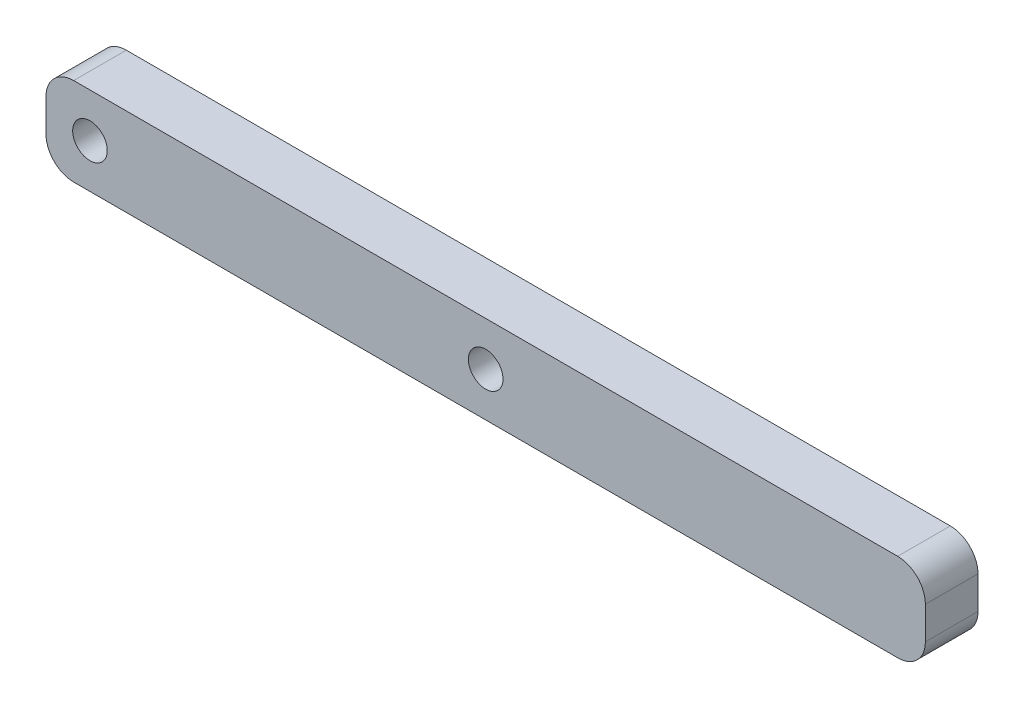
ISO-10303-21;
HEADER;
FILE_DESCRIPTION(('STEP AP214'),'2;1');
FILE_NAME('part.step','',(''),(''),'','','');
FILE_SCHEMA(('AUTOMOTIVE_DESIGN { 1 0 10303 214 1 1 1 1 }'));
ENDSEC;
DATA;
#1=APPLICATION_CONTEXT('core data for automotive mechanical design processes');
#2=APPLICATION_PROTOCOL_DEFINITION('international standard','automotive_design',2000,#1);
#3=PRODUCT_CONTEXT('',#1,'mechanical');
#4=PRODUCT('Part','Part','',(#3));
#5=PRODUCT_RELATED_PRODUCT_CATEGORY('part','',(#4));
#6=PRODUCT_DEFINITION_FORMATION('','',#4);
#7=PRODUCT_DEFINITION_CONTEXT('part definition',#1,'design');
#8=PRODUCT_DEFINITION('design','',#6,#7);
#9=PRODUCT_DEFINITION_SHAPE('','',#8);
#10=(LENGTH_UNIT() NAMED_UNIT(*) SI_UNIT(.MILLI.,.METRE.));
#11=(NAMED_UNIT(*) PLANE_ANGLE_UNIT() SI_UNIT($,.RADIAN.));
#12=(NAMED_UNIT(*) SI_UNIT($,.STERADIAN.) SOLID_ANGLE_UNIT());
#13=UNCERTAINTY_MEASURE_WITH_UNIT(LENGTH_MEASURE(1.E-05),#10,'distance_accuracy_value','');
#14=(GEOMETRIC_REPRESENTATION_CONTEXT(3) GLOBAL_UNCERTAINTY_ASSIGNED_CONTEXT((#13)) GLOBAL_UNIT_ASSIGNED_CONTEXT((#10,
#11,#12)) REPRESENTATION_CONTEXT('',''));
#15=CARTESIAN_POINT('',(0.,0.,0.));
#16=DIRECTION('',(0.,0.,1.));
#17=DIRECTION('',(1.,0.,0.));
#18=AXIS2_PLACEMENT_3D('',#15,#16,#17);
#19=CARTESIAN_POINT('',(0.,0.,7.6));
#20=DIRECTION('',(0.,0.,1.));
#21=DIRECTION('',(1.,0.,0.));
#22=AXIS2_PLACEMENT_3D('',#19,#20,#21);
#23=PLANE('',#22);
#24=CARTESIAN_POINT('',(-120.65,6.35,7.6));
#25=DIRECTION('',(0.,0.,1.));
#26=DIRECTION('',(1.,0.,0.));
#27=AXIS2_PLACEMENT_3D('',#24,#25,#26);
#28=CIRCLE('',#27,2.5);
#29=CARTESIAN_POINT('',(-123.15,6.35,7.6));
#30=VERTEX_POINT('',#29);
#31=EDGE_CURVE('E132',#30,#30,#28,.T.);
#32=ORIENTED_EDGE('',*,*,#31,.F.);
#33=EDGE_LOOP('',(#32));
#34=FACE_BOUND('',#33,.T.);
#35=DIRECTION('',(0.,-1.,0.));
#36=VECTOR('',#35,1.);
#37=CARTESIAN_POINT('',(-127.,12.7,7.6));
#38=LINE('',#37,#36);
#39=CARTESIAN_POINT('',(-127.,8.7,7.6));
#40=VERTEX_POINT('',#39);
#41=CARTESIAN_POINT('',(-127.,4.,7.6));
#42=VERTEX_POINT('',#41);
#43=EDGE_CURVE('E137',#40,#42,#38,.T.);
#44=ORIENTED_EDGE('',*,*,#43,.T.);
#45=CARTESIAN_POINT('',(-123.,4.,7.6));
#46=DIRECTION('',(0.,0.,1.));
#47=DIRECTION('',(1.,0.,0.));
#48=AXIS2_PLACEMENT_3D('',#45,#46,#47);
#49=CIRCLE('',#48,4.);
#50=CARTESIAN_POINT('',(-123.,0.,7.6));
#51=VERTEX_POINT('',#50);
#52=EDGE_CURVE('E152',#42,#51,#49,.T.);
#53=ORIENTED_EDGE('',*,*,#52,.T.);
#54=DIRECTION('',(1.,0.,0.));
#55=VECTOR('',#54,1.);
#56=CARTESIAN_POINT('',(-127.,0.,7.6));
#57=LINE('',#56,#55);
#58=CARTESIAN_POINT('',(-4.,0.,7.6));
#59=VERTEX_POINT('',#58);
#60=EDGE_CURVE('E119',#51,#59,#57,.T.);
#61=ORIENTED_EDGE('',*,*,#60,.T.);
#62=CARTESIAN_POINT('',(-4.,4.,7.6));
#63=DIRECTION('',(0.,0.,1.));
#64=DIRECTION('',(1.,0.,0.));
#65=AXIS2_PLACEMENT_3D('',#62,#63,#64);
#66=CIRCLE('',#65,4.);
#67=CARTESIAN_POINT('',(0.,4.,7.6));
#68=VERTEX_POINT('',#67);
#69=EDGE_CURVE('E150',#59,#68,#66,.T.);
#70=ORIENTED_EDGE('',*,*,#69,.T.);
#71=DIRECTION('',(0.,1.,0.));
#72=VECTOR('',#71,1.);
#73=CARTESIAN_POINT('',(0.,12.7,7.6));
#74=LINE('',#73,#72);
#75=CARTESIAN_POINT('',(0.,8.7,7.6));
#76=VERTEX_POINT('',#75);
#77=EDGE_CURVE('E163',#68,#76,#74,.T.);
#78=ORIENTED_EDGE('',*,*,#77,.T.);
#79=CARTESIAN_POINT('',(-4.,8.7,7.6));
#80=DIRECTION('',(0.,0.,1.));
#81=DIRECTION('',(1.,0.,0.));
#82=AXIS2_PLACEMENT_3D('',#79,#80,#81);
#83=CIRCLE('',#82,4.);
#84=CARTESIAN_POINT('',(-4.,12.7,7.6));
#85=VERTEX_POINT('',#84);
#86=EDGE_CURVE('E54',#76,#85,#83,.T.);
#87=ORIENTED_EDGE('',*,*,#86,.T.);
#88=DIRECTION('',(-1.,0.,0.));
#89=VECTOR('',#88,1.);
#90=CARTESIAN_POINT('',(-127.,12.7,7.6));
#91=LINE('',#90,#89);
#92=CARTESIAN_POINT('',(-123.,12.7,7.6));
#93=VERTEX_POINT('',#92);
#94=EDGE_CURVE('E138',#85,#93,#91,.T.);
#95=ORIENTED_EDGE('',*,*,#94,.T.);
#96=CARTESIAN_POINT('',(-123.,8.7,7.6));
#97=DIRECTION('',(0.,0.,1.));
#98=DIRECTION('',(1.,0.,0.));
#99=AXIS2_PLACEMENT_3D('',#96,#97,#98);
#100=CIRCLE('',#99,4.);
#101=EDGE_CURVE('E147',#93,#40,#100,.T.);
#102=ORIENTED_EDGE('',*,*,#101,.T.);
#103=EDGE_LOOP('',(#44,#53,#61,#70,#78,#87,#95,#102));
#104=FACE_BOUND('',#103,.T.);
#105=CARTESIAN_POINT('',(-63.5,6.35,7.6));
#106=DIRECTION('',(0.,0.,1.));
#107=DIRECTION('',(1.,0.,0.));
#108=AXIS2_PLACEMENT_3D('',#105,#106,#107);
#109=CIRCLE('',#108,2.5);
#110=CARTESIAN_POINT('',(-66.,6.35,7.6));
#111=VERTEX_POINT('',#110);
#112=EDGE_CURVE('E180',#111,#111,#109,.T.);
#113=ORIENTED_EDGE('',*,*,#112,.F.);
#114=EDGE_LOOP('',(#113));
#115=FACE_BOUND('',#114,.T.);
#116=ADVANCED_FACE('F33',(#34,#104,#115),#23,.T.);
#117=CARTESIAN_POINT('',(0.,0.,0.));
#118=DIRECTION('',(0.,0.,1.));
#119=DIRECTION('',(1.,0.,0.));
#120=AXIS2_PLACEMENT_3D('',#117,#118,#119);
#121=PLANE('',#120);
#122=DIRECTION('',(1.,0.,0.));
#123=VECTOR('',#122,1.);
#124=CARTESIAN_POINT('',(-127.,0.,0.));
#125=LINE('',#124,#123);
#126=CARTESIAN_POINT('',(-123.,0.,0.));
#127=VERTEX_POINT('',#126);
#128=CARTESIAN_POINT('',(-4.,0.,0.));
#129=VERTEX_POINT('',#128);
#130=EDGE_CURVE('E116',#127,#129,#125,.T.);
#131=ORIENTED_EDGE('',*,*,#130,.F.);
#132=CARTESIAN_POINT('',(-123.,4.,0.));
#133=DIRECTION('',(0.,0.,1.));
#134=DIRECTION('',(1.,0.,0.));
#135=AXIS2_PLACEMENT_3D('',#132,#133,#134);
#136=CIRCLE('',#135,4.);
#137=CARTESIAN_POINT('',(-127.,4.,0.));
#138=VERTEX_POINT('',#137);
#139=EDGE_CURVE('E99',#127,#138,#136,.F.);
#140=ORIENTED_EDGE('',*,*,#139,.T.);
#141=DIRECTION('',(0.,-1.,0.));
#142=VECTOR('',#141,1.);
#143=CARTESIAN_POINT('',(-127.,12.7,0.));
#144=LINE('',#143,#142);
#145=CARTESIAN_POINT('',(-127.,8.7,0.));
#146=VERTEX_POINT('',#145);
#147=EDGE_CURVE('E127',#146,#138,#144,.T.);
#148=ORIENTED_EDGE('',*,*,#147,.F.);
#149=CARTESIAN_POINT('',(-123.,8.7,0.));
#150=DIRECTION('',(0.,0.,1.));
#151=DIRECTION('',(1.,0.,0.));
#152=AXIS2_PLACEMENT_3D('',#149,#150,#151);
#153=CIRCLE('',#152,4.);
#154=CARTESIAN_POINT('',(-123.,12.7,0.));
#155=VERTEX_POINT('',#154);
#156=EDGE_CURVE('E120',#146,#155,#153,.F.);
#157=ORIENTED_EDGE('',*,*,#156,.T.);
#158=DIRECTION('',(-1.,0.,0.));
#159=VECTOR('',#158,1.);
#160=CARTESIAN_POINT('',(-127.,12.7,0.));
#161=LINE('',#160,#159);
#162=CARTESIAN_POINT('',(-4.,12.7,0.));
#163=VERTEX_POINT('',#162);
#164=EDGE_CURVE('E130',#163,#155,#161,.T.);
#165=ORIENTED_EDGE('',*,*,#164,.F.);
#166=CARTESIAN_POINT('',(-4.,8.7,0.));
#167=DIRECTION('',(0.,0.,1.));
#168=DIRECTION('',(1.,0.,0.));
#169=AXIS2_PLACEMENT_3D('',#166,#167,#168);
#170=CIRCLE('',#169,4.);
#171=CARTESIAN_POINT('',(0.,8.7,0.));
#172=VERTEX_POINT('',#171);
#173=EDGE_CURVE('E141',#163,#172,#170,.F.);
#174=ORIENTED_EDGE('',*,*,#173,.T.);
#175=DIRECTION('',(0.,1.,0.));
#176=VECTOR('',#175,1.);
#177=CARTESIAN_POINT('',(0.,12.7,0.));
#178=LINE('',#177,#176);
#179=CARTESIAN_POINT('',(0.,4.,0.));
#180=VERTEX_POINT('',#179);
#181=EDGE_CURVE('E126',#180,#172,#178,.T.);
#182=ORIENTED_EDGE('',*,*,#181,.F.);
#183=CARTESIAN_POINT('',(-4.,4.,0.));
#184=DIRECTION('',(0.,0.,1.));
#185=DIRECTION('',(1.,0.,0.));
#186=AXIS2_PLACEMENT_3D('',#183,#184,#185);
#187=CIRCLE('',#186,4.);
#188=EDGE_CURVE('E110',#180,#129,#187,.F.);
#189=ORIENTED_EDGE('',*,*,#188,.T.);
#190=EDGE_LOOP('',(#131,#140,#148,#157,#165,#174,#182,#189));
#191=FACE_BOUND('',#190,.T.);
#192=CARTESIAN_POINT('',(-120.65,6.35,0.));
#193=DIRECTION('',(0.,0.,1.));
#194=DIRECTION('',(1.,0.,0.));
#195=AXIS2_PLACEMENT_3D('',#192,#193,#194);
#196=CIRCLE('',#195,2.5);
#197=CARTESIAN_POINT('',(-123.15,6.35,0.));
#198=VERTEX_POINT('',#197);
#199=EDGE_CURVE('E177',#198,#198,#196,.T.);
#200=ORIENTED_EDGE('',*,*,#199,.T.);
#201=EDGE_LOOP('',(#200));
#202=FACE_BOUND('',#201,.T.);
#203=CARTESIAN_POINT('',(-63.5,6.35,0.));
#204=DIRECTION('',(0.,0.,1.));
#205=DIRECTION('',(1.,0.,0.));
#206=AXIS2_PLACEMENT_3D('',#203,#204,#205);
#207=CIRCLE('',#206,2.5);
#208=CARTESIAN_POINT('',(-66.,6.35,0.));
#209=VERTEX_POINT('',#208);
#210=EDGE_CURVE('E183',#209,#209,#207,.T.);
#211=ORIENTED_EDGE('',*,*,#210,.T.);
#212=EDGE_LOOP('',(#211));
#213=FACE_BOUND('',#212,.T.);
#214=ADVANCED_FACE('F123',(#191,#202,#213),#121,.F.);
#215=CARTESIAN_POINT('',(-127.,12.7,7.6));
#216=DIRECTION('',(1.,0.,0.));
#217=DIRECTION('',(0.,0.,-1.));
#218=AXIS2_PLACEMENT_3D('',#215,#216,#217);
#219=PLANE('',#218);
#220=ORIENTED_EDGE('',*,*,#147,.T.);
#221=DIRECTION('',(0.,0.,-1.));
#222=VECTOR('',#221,1.);
#223=CARTESIAN_POINT('',(-127.,4.,7.6));
#224=LINE('',#223,#222);
#225=EDGE_CURVE('E104',#138,#42,#224,.F.);
#226=ORIENTED_EDGE('',*,*,#225,.T.);
#227=ORIENTED_EDGE('',*,*,#43,.F.);
#228=DIRECTION('',(0.,0.,-1.));
#229=VECTOR('',#228,1.);
#230=CARTESIAN_POINT('',(-127.,8.7,7.6));
#231=LINE('',#230,#229);
#232=EDGE_CURVE('E109',#40,#146,#231,.T.);
#233=ORIENTED_EDGE('',*,*,#232,.T.);
#234=EDGE_LOOP('',(#220,#226,#227,#233));
#235=FACE_BOUND('',#234,.T.);
#236=ADVANCED_FACE('F198',(#235),#219,.F.);
#237=CARTESIAN_POINT('',(-127.,0.,7.6));
#238=DIRECTION('',(0.,1.,0.));
#239=DIRECTION('',(0.,0.,1.));
#240=AXIS2_PLACEMENT_3D('',#237,#238,#239);
#241=PLANE('',#240);
#242=ORIENTED_EDGE('',*,*,#60,.F.);
#243=DIRECTION('',(0.,0.,-1.));
#244=VECTOR('',#243,1.);
#245=CARTESIAN_POINT('',(-123.,0.,7.6));
#246=LINE('',#245,#244);
#247=EDGE_CURVE('E103',#51,#127,#246,.T.);
#248=ORIENTED_EDGE('',*,*,#247,.T.);
#249=ORIENTED_EDGE('',*,*,#130,.T.);
#250=DIRECTION('',(0.,0.,-1.));
#251=VECTOR('',#250,1.);
#252=CARTESIAN_POINT('',(-4.,0.,7.6));
#253=LINE('',#252,#251);
#254=EDGE_CURVE('E121',#129,#59,#253,.F.);
#255=ORIENTED_EDGE('',*,*,#254,.T.);
#256=EDGE_LOOP('',(#242,#248,#249,#255));
#257=FACE_BOUND('',#256,.T.);
#258=ADVANCED_FACE('F115',(#257),#241,.F.);
#259=CARTESIAN_POINT('',(0.,12.7,7.6));
#260=DIRECTION('',(-1.,0.,0.));
#261=DIRECTION('',(0.,0.,1.));
#262=AXIS2_PLACEMENT_3D('',#259,#260,#261);
#263=PLANE('',#262);
#264=ORIENTED_EDGE('',*,*,#77,.F.);
#265=DIRECTION('',(0.,0.,-1.));
#266=VECTOR('',#265,1.);
#267=CARTESIAN_POINT('',(0.,4.,7.6));
#268=LINE('',#267,#266);
#269=EDGE_CURVE('E156',#68,#180,#268,.T.);
#270=ORIENTED_EDGE('',*,*,#269,.T.);
#271=ORIENTED_EDGE('',*,*,#181,.T.);
#272=DIRECTION('',(0.,0.,-1.));
#273=VECTOR('',#272,1.);
#274=CARTESIAN_POINT('',(0.,8.7,7.6));
#275=LINE('',#274,#273);
#276=EDGE_CURVE('E154',#172,#76,#275,.F.);
#277=ORIENTED_EDGE('',*,*,#276,.T.);
#278=EDGE_LOOP('',(#264,#270,#271,#277));
#279=FACE_BOUND('',#278,.T.);
#280=ADVANCED_FACE('F161',(#279),#263,.F.);
#281=CARTESIAN_POINT('',(-127.,12.7,7.6));
#282=DIRECTION('',(0.,-1.,0.));
#283=DIRECTION('',(1.,0.,0.));
#284=AXIS2_PLACEMENT_3D('',#281,#282,#283);
#285=PLANE('',#284);
#286=ORIENTED_EDGE('',*,*,#94,.F.);
#287=DIRECTION('',(0.,0.,-1.));
#288=VECTOR('',#287,1.);
#289=CARTESIAN_POINT('',(-4.,12.7,7.6));
#290=LINE('',#289,#288);
#291=EDGE_CURVE('E11',#85,#163,#290,.T.);
#292=ORIENTED_EDGE('',*,*,#291,.T.);
#293=ORIENTED_EDGE('',*,*,#164,.T.);
#294=DIRECTION('',(0.,0.,-1.));
#295=VECTOR('',#294,1.);
#296=CARTESIAN_POINT('',(-123.,12.7,7.6));
#297=LINE('',#296,#295);
#298=EDGE_CURVE('E41',#155,#93,#297,.F.);
#299=ORIENTED_EDGE('',*,*,#298,.T.);
#300=EDGE_LOOP('',(#286,#292,#293,#299));
#301=FACE_BOUND('',#300,.T.);
#302=ADVANCED_FACE('F170',(#301),#285,.F.);
#303=CARTESIAN_POINT('',(-120.65,6.35,7.6));
#304=DIRECTION('',(0.,0.,-1.));
#305=DIRECTION('',(-1.,0.,0.));
#306=AXIS2_PLACEMENT_3D('',#303,#304,#305);
#307=CYLINDRICAL_SURFACE('',#306,2.5);
#308=CARTESIAN_POINT('',(-123.15,6.35,7.6));
#309=CARTESIAN_POINT('',(-123.15,6.35,7.52083333333333));
#310=CARTESIAN_POINT('',(-123.15,6.35,7.44166666666667));
#311=CARTESIAN_POINT('',(-123.15,6.35,7.28333333333333));
#312=CARTESIAN_POINT('',(-123.15,6.35,7.20416666666667));
#313=CARTESIAN_POINT('',(-123.15,6.35,7.04583333333333));
#314=CARTESIAN_POINT('',(-123.15,6.35,6.96666666666667));
#315=CARTESIAN_POINT('',(-123.15,6.35,6.80833333333333));
#316=CARTESIAN_POINT('',(-123.15,6.35,6.72916666666667));
#317=CARTESIAN_POINT('',(-123.15,6.35,6.57083333333333));
#318=CARTESIAN_POINT('',(-123.15,6.35,6.49166666666667));
#319=CARTESIAN_POINT('',(-123.15,6.35,6.33333333333333));
#320=CARTESIAN_POINT('',(-123.15,6.35,6.25416666666667));
#321=CARTESIAN_POINT('',(-123.15,6.35,6.09583333333333));
#322=CARTESIAN_POINT('',(-123.15,6.35,6.01666666666667));
#323=CARTESIAN_POINT('',(-123.15,6.35,5.85833333333333));
#324=CARTESIAN_POINT('',(-123.15,6.35,5.77916666666667));
#325=CARTESIAN_POINT('',(-123.15,6.35,5.62083333333333));
#326=CARTESIAN_POINT('',(-123.15,6.35,5.54166666666667));
#327=CARTESIAN_POINT('',(-123.15,6.35,5.38333333333333));
#328=CARTESIAN_POINT('',(-123.15,6.35,5.30416666666667));
#329=CARTESIAN_POINT('',(-123.15,6.35,5.14583333333333));
#330=CARTESIAN_POINT('',(-123.15,6.35,5.06666666666667));
#331=CARTESIAN_POINT('',(-123.15,6.35,4.90833333333333));
#332=CARTESIAN_POINT('',(-123.15,6.35,4.82916666666667));
#333=CARTESIAN_POINT('',(-123.15,6.35,4.67083333333333));
#334=CARTESIAN_POINT('',(-123.15,6.35,4.59166666666667));
#335=CARTESIAN_POINT('',(-123.15,6.35,4.43333333333333));
#336=CARTESIAN_POINT('',(-123.15,6.35,4.35416666666667));
#337=CARTESIAN_POINT('',(-123.15,6.35,4.19583333333333));
#338=CARTESIAN_POINT('',(-123.15,6.35,4.11666666666667));
#339=CARTESIAN_POINT('',(-123.15,6.35,3.95833333333333));
#340=CARTESIAN_POINT('',(-123.15,6.35,3.87916666666667));
#341=CARTESIAN_POINT('',(-123.15,6.35,3.72083333333333));
#342=CARTESIAN_POINT('',(-123.15,6.35,3.64166666666667));
#343=CARTESIAN_POINT('',(-123.15,6.35,3.48333333333333));
#344=CARTESIAN_POINT('',(-123.15,6.35,3.40416666666667));
#345=CARTESIAN_POINT('',(-123.15,6.35,3.24583333333333));
#346=CARTESIAN_POINT('',(-123.15,6.35,3.16666666666667));
#347=CARTESIAN_POINT('',(-123.15,6.35,3.00833333333333));
#348=CARTESIAN_POINT('',(-123.15,6.35,2.92916666666667));
#349=CARTESIAN_POINT('',(-123.15,6.35,2.77083333333333));
#350=CARTESIAN_POINT('',(-123.15,6.35,2.69166666666667));
#351=CARTESIAN_POINT('',(-123.15,6.35,2.53333333333333));
#352=CARTESIAN_POINT('',(-123.15,6.35,2.45416666666667));
#353=CARTESIAN_POINT('',(-123.15,6.35,2.29583333333333));
#354=CARTESIAN_POINT('',(-123.15,6.35,2.21666666666667));
#355=CARTESIAN_POINT('',(-123.15,6.35,2.05833333333333));
#356=CARTESIAN_POINT('',(-123.15,6.35,1.97916666666667));
#357=CARTESIAN_POINT('',(-123.15,6.35,1.82083333333333));
#358=CARTESIAN_POINT('',(-123.15,6.35,1.74166666666667));
#359=CARTESIAN_POINT('',(-123.15,6.35,1.58333333333333));
#360=CARTESIAN_POINT('',(-123.15,6.35,1.50416666666667));
#361=CARTESIAN_POINT('',(-123.15,6.35,1.34583333333333));
#362=CARTESIAN_POINT('',(-123.15,6.35,1.26666666666667));
#363=CARTESIAN_POINT('',(-123.15,6.35,1.10833333333333));
#364=CARTESIAN_POINT('',(-123.15,6.35,1.02916666666667));
#365=CARTESIAN_POINT('',(-123.15,6.35,0.870833333333334));
#366=CARTESIAN_POINT('',(-123.15,6.35,0.791666666666667));
#367=CARTESIAN_POINT('',(-123.15,6.35,0.633333333333334));
#368=CARTESIAN_POINT('',(-123.15,6.35,0.554166666666667));
#369=CARTESIAN_POINT('',(-123.15,6.35,0.395833333333333));
#370=CARTESIAN_POINT('',(-123.15,6.35,0.316666666666666));
#371=CARTESIAN_POINT('',(-123.15,6.35,0.158333333333333));
#372=CARTESIAN_POINT('',(-123.15,6.35,0.0791666666666666));
#373=CARTESIAN_POINT('',(-123.15,6.35,0.));
#374=B_SPLINE_CURVE_WITH_KNOTS('',3,(#308,#309,#310,#311,#312,#313,#314,#315,#316,#317,#318,
#319,#320,#321,#322,#323,#324,#325,#326,#327,#328,#329,#330,#331,#332,#333,#334,#335,#336,#337,
#338,#339,#340,#341,#342,#343,#344,#345,#346,#347,#348,#349,#350,#351,#352,#353,#354,#355,#356,
#357,#358,#359,#360,#361,#362,#363,#364,#365,#366,#367,#368,#369,#370,#371,#372,#373),
.UNSPECIFIED.,.F.,.F.,(4,2,2,2,2,2,2,2,2,2,2,2,2,2,2,2,2,2,2,2,2,2,2,2,2,2,2,2,2,2,2,2,4),(0.,
0.237500000000001,0.475000000000001,0.7125,0.95,1.1875,1.425,1.6625,1.9,2.1375,2.375,2.6125,
2.85,3.0875,3.325,3.5625,3.8,4.0375,4.275,4.5125,4.75,4.9875,5.225,5.4625,5.7,5.9375,6.175,
6.4125,6.65,6.8875,7.125,7.3625,7.6),.UNSPECIFIED.);
#375=EDGE_CURVE('BSEAM202',#30,#198,#374,.T.);
#376=ORIENTED_EDGE('',*,*,#31,.T.);
#377=ORIENTED_EDGE('',*,*,#199,.F.);
#378=ORIENTED_EDGE('',*,*,#375,.T.);
#379=ORIENTED_EDGE('',*,*,#375,.F.);
#380=EDGE_LOOP('',(#376,#378,#377,#379));
#381=FACE_BOUND('',#380,.T.);
#382=ADVANCED_FACE('F202',(#381),#307,.F.);
#383=CARTESIAN_POINT('',(-63.5,6.35,7.6));
#384=DIRECTION('',(0.,0.,-1.));
#385=DIRECTION('',(-1.,0.,0.));
#386=AXIS2_PLACEMENT_3D('',#383,#384,#385);
#387=CYLINDRICAL_SURFACE('',#386,2.5);
#388=CARTESIAN_POINT('',(-66.,6.35,7.6));
#389=CARTESIAN_POINT('',(-66.,6.35,7.52083333333333));
#390=CARTESIAN_POINT('',(-66.,6.35,7.44166666666667));
#391=CARTESIAN_POINT('',(-66.,6.35,7.28333333333333));
#392=CARTESIAN_POINT('',(-66.,6.35,7.20416666666667));
#393=CARTESIAN_POINT('',(-66.,6.35,7.04583333333333));
#394=CARTESIAN_POINT('',(-66.,6.35,6.96666666666667));
#395=CARTESIAN_POINT('',(-66.,6.35,6.80833333333333));
#396=CARTESIAN_POINT('',(-66.,6.35,6.72916666666667));
#397=CARTESIAN_POINT('',(-66.,6.35,6.57083333333333));
#398=CARTESIAN_POINT('',(-66.,6.35,6.49166666666667));
#399=CARTESIAN_POINT('',(-66.,6.35,6.33333333333333));
#400=CARTESIAN_POINT('',(-66.,6.35,6.25416666666667));
#401=CARTESIAN_POINT('',(-66.,6.35,6.09583333333333));
#402=CARTESIAN_POINT('',(-66.,6.35,6.01666666666667));
#403=CARTESIAN_POINT('',(-66.,6.35,5.85833333333333));
#404=CARTESIAN_POINT('',(-66.,6.35,5.77916666666667));
#405=CARTESIAN_POINT('',(-66.,6.35,5.62083333333333));
#406=CARTESIAN_POINT('',(-66.,6.35,5.54166666666667));
#407=CARTESIAN_POINT('',(-66.,6.35,5.38333333333333));
#408=CARTESIAN_POINT('',(-66.,6.35,5.30416666666667));
#409=CARTESIAN_POINT('',(-66.,6.35,5.14583333333333));
#410=CARTESIAN_POINT('',(-66.,6.35,5.06666666666667));
#411=CARTESIAN_POINT('',(-66.,6.35,4.90833333333333));
#412=CARTESIAN_POINT('',(-66.,6.35,4.82916666666667));
#413=CARTESIAN_POINT('',(-66.,6.35,4.67083333333333));
#414=CARTESIAN_POINT('',(-66.,6.35,4.59166666666667));
#415=CARTESIAN_POINT('',(-66.,6.35,4.43333333333333));
#416=CARTESIAN_POINT('',(-66.,6.35,4.35416666666667));
#417=CARTESIAN_POINT('',(-66.,6.35,4.19583333333333));
#418=CARTESIAN_POINT('',(-66.,6.35,4.11666666666667));
#419=CARTESIAN_POINT('',(-66.,6.35,3.95833333333333));
#420=CARTESIAN_POINT('',(-66.,6.35,3.87916666666667));
#421=CARTESIAN_POINT('',(-66.,6.35,3.72083333333333));
#422=CARTESIAN_POINT('',(-66.,6.35,3.64166666666667));
#423=CARTESIAN_POINT('',(-66.,6.35,3.48333333333333));
#424=CARTESIAN_POINT('',(-66.,6.35,3.40416666666667));
#425=CARTESIAN_POINT('',(-66.,6.35,3.24583333333333));
#426=CARTESIAN_POINT('',(-66.,6.35,3.16666666666667));
#427=CARTESIAN_POINT('',(-66.,6.35,3.00833333333333));
#428=CARTESIAN_POINT('',(-66.,6.35,2.92916666666667));
#429=CARTESIAN_POINT('',(-66.,6.35,2.77083333333333));
#430=CARTESIAN_POINT('',(-66.,6.35,2.69166666666667));
#431=CARTESIAN_POINT('',(-66.,6.35,2.53333333333333));
#432=CARTESIAN_POINT('',(-66.,6.35,2.45416666666667));
#433=CARTESIAN_POINT('',(-66.,6.35,2.29583333333333));
#434=CARTESIAN_POINT('',(-66.,6.35,2.21666666666667));
#435=CARTESIAN_POINT('',(-66.,6.35,2.05833333333333));
#436=CARTESIAN_POINT('',(-66.,6.35,1.97916666666667));
#437=CARTESIAN_POINT('',(-66.,6.35,1.82083333333333));
#438=CARTESIAN_POINT('',(-66.,6.35,1.74166666666667));
#439=CARTESIAN_POINT('',(-66.,6.35,1.58333333333333));
#440=CARTESIAN_POINT('',(-66.,6.35,1.50416666666667));
#441=CARTESIAN_POINT('',(-66.,6.35,1.34583333333333));
#442=CARTESIAN_POINT('',(-66.,6.35,1.26666666666667));
#443=CARTESIAN_POINT('',(-66.,6.35,1.10833333333333));
#444=CARTESIAN_POINT('',(-66.,6.35,1.02916666666667));
#445=CARTESIAN_POINT('',(-66.,6.35,0.870833333333334));
#446=CARTESIAN_POINT('',(-66.,6.35,0.791666666666667));
#447=CARTESIAN_POINT('',(-66.,6.35,0.633333333333334));
#448=CARTESIAN_POINT('',(-66.,6.35,0.554166666666667));
#449=CARTESIAN_POINT('',(-66.,6.35,0.395833333333333));
#450=CARTESIAN_POINT('',(-66.,6.35,0.316666666666666));
#451=CARTESIAN_POINT('',(-66.,6.35,0.158333333333333));
#452=CARTESIAN_POINT('',(-66.,6.35,0.0791666666666666));
#453=CARTESIAN_POINT('',(-66.,6.35,0.));
#454=B_SPLINE_CURVE_WITH_KNOTS('',3,(#388,#389,#390,#391,#392,#393,#394,#395,#396,#397,#398,
#399,#400,#401,#402,#403,#404,#405,#406,#407,#408,#409,#410,#411,#412,#413,#414,#415,#416,#417,
#418,#419,#420,#421,#422,#423,#424,#425,#426,#427,#428,#429,#430,#431,#432,#433,#434,#435,#436,
#437,#438,#439,#440,#441,#442,#443,#444,#445,#446,#447,#448,#449,#450,#451,#452,#453),
.UNSPECIFIED.,.F.,.F.,(4,2,2,2,2,2,2,2,2,2,2,2,2,2,2,2,2,2,2,2,2,2,2,2,2,2,2,2,2,2,2,2,4),(0.,
0.237500000000001,0.475000000000001,0.7125,0.95,1.1875,1.425,1.6625,1.9,2.1375,2.375,2.6125,
2.85,3.0875,3.325,3.5625,3.8,4.0375,4.275,4.5125,4.75,4.9875,5.225,5.4625,5.7,5.9375,6.175,
6.4125,6.65,6.8875,7.125,7.3625,7.6),.UNSPECIFIED.);
#455=EDGE_CURVE('BSEAM189',#111,#209,#454,.T.);
#456=ORIENTED_EDGE('',*,*,#112,.T.);
#457=ORIENTED_EDGE('',*,*,#210,.F.);
#458=ORIENTED_EDGE('',*,*,#455,.T.);
#459=ORIENTED_EDGE('',*,*,#455,.F.);
#460=EDGE_LOOP('',(#456,#458,#457,#459));
#461=FACE_BOUND('',#460,.T.);
#462=ADVANCED_FACE('F189',(#461),#387,.F.);
#463=CARTESIAN_POINT('',(-123.,4.,7.6));
#464=DIRECTION('',(0.,0.,-1.));
#465=DIRECTION('',(-1.,0.,0.));
#466=AXIS2_PLACEMENT_3D('',#463,#464,#465);
#467=CYLINDRICAL_SURFACE('',#466,4.);
#468=ORIENTED_EDGE('',*,*,#52,.F.);
#469=ORIENTED_EDGE('',*,*,#225,.F.);
#470=ORIENTED_EDGE('',*,*,#139,.F.);
#471=ORIENTED_EDGE('',*,*,#247,.F.);
#472=EDGE_LOOP('',(#468,#469,#470,#471));
#473=FACE_BOUND('',#472,.T.);
#474=ADVANCED_FACE('F102',(#473),#467,.T.);
#475=CARTESIAN_POINT('',(-4.,4.,7.6));
#476=DIRECTION('',(0.,0.,-1.));
#477=DIRECTION('',(-1.,0.,0.));
#478=AXIS2_PLACEMENT_3D('',#475,#476,#477);
#479=CYLINDRICAL_SURFACE('',#478,4.);
#480=ORIENTED_EDGE('',*,*,#69,.F.);
#481=ORIENTED_EDGE('',*,*,#254,.F.);
#482=ORIENTED_EDGE('',*,*,#188,.F.);
#483=ORIENTED_EDGE('',*,*,#269,.F.);
#484=EDGE_LOOP('',(#480,#481,#482,#483));
#485=FACE_BOUND('',#484,.T.);
#486=ADVANCED_FACE('F216',(#485),#479,.T.);
#487=CARTESIAN_POINT('',(-4.,8.7,7.6));
#488=DIRECTION('',(0.,0.,-1.));
#489=DIRECTION('',(-1.,0.,0.));
#490=AXIS2_PLACEMENT_3D('',#487,#488,#489);
#491=CYLINDRICAL_SURFACE('',#490,4.);
#492=ORIENTED_EDGE('',*,*,#86,.F.);
#493=ORIENTED_EDGE('',*,*,#276,.F.);
#494=ORIENTED_EDGE('',*,*,#173,.F.);
#495=ORIENTED_EDGE('',*,*,#291,.F.);
#496=EDGE_LOOP('',(#492,#493,#494,#495));
#497=FACE_BOUND('',#496,.T.);
#498=ADVANCED_FACE('F169',(#497),#491,.T.);
#499=CARTESIAN_POINT('',(-123.,8.7,7.6));
#500=DIRECTION('',(0.,0.,-1.));
#501=DIRECTION('',(-1.,0.,0.));
#502=AXIS2_PLACEMENT_3D('',#499,#500,#501);
#503=CYLINDRICAL_SURFACE('',#502,4.);
#504=ORIENTED_EDGE('',*,*,#101,.F.);
#505=ORIENTED_EDGE('',*,*,#298,.F.);
#506=ORIENTED_EDGE('',*,*,#156,.F.);
#507=ORIENTED_EDGE('',*,*,#232,.F.);
#508=EDGE_LOOP('',(#504,#505,#506,#507));
#509=FACE_BOUND('',#508,.T.);
#510=ADVANCED_FACE('F35',(#509),#503,.T.);
#511=CLOSED_SHELL('',(#116,#214,#236,#258,#280,#302,#382,#462,#474,#486,#498,#510));
#512=MANIFOLD_SOLID_BREP('B2',#511);
#513=ADVANCED_BREP_SHAPE_REPRESENTATION('',(#18,#512),#14);
#514=SHAPE_DEFINITION_REPRESENTATION(#9,#513);
ENDSEC;
END-ISO-10303-21;
